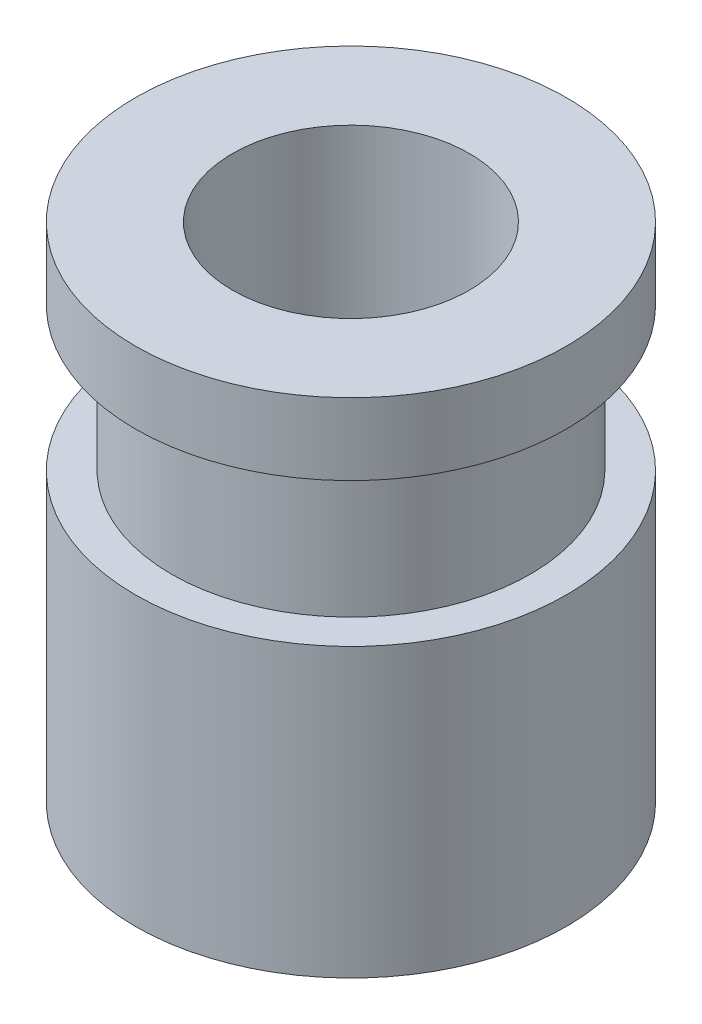
ISO-10303-21;
HEADER;
FILE_DESCRIPTION(('STEP AP214'),'2;1');
FILE_NAME('part.step','',(''),(''),'','','');
FILE_SCHEMA(('AUTOMOTIVE_DESIGN { 1 0 10303 214 1 1 1 1 }'));
ENDSEC;
DATA;
#1=APPLICATION_CONTEXT('core data for automotive mechanical design processes');
#2=APPLICATION_PROTOCOL_DEFINITION('international standard','automotive_design',2000,#1);
#3=PRODUCT_CONTEXT('',#1,'mechanical');
#4=PRODUCT('Part','Part','',(#3));
#5=PRODUCT_RELATED_PRODUCT_CATEGORY('part','',(#4));
#6=PRODUCT_DEFINITION_FORMATION('','',#4);
#7=PRODUCT_DEFINITION_CONTEXT('part definition',#1,'design');
#8=PRODUCT_DEFINITION('design','',#6,#7);
#9=PRODUCT_DEFINITION_SHAPE('','',#8);
#10=(LENGTH_UNIT() NAMED_UNIT(*) SI_UNIT(.MILLI.,.METRE.));
#11=(NAMED_UNIT(*) PLANE_ANGLE_UNIT() SI_UNIT($,.RADIAN.));
#12=(NAMED_UNIT(*) SI_UNIT($,.STERADIAN.) SOLID_ANGLE_UNIT());
#13=UNCERTAINTY_MEASURE_WITH_UNIT(LENGTH_MEASURE(1.E-05),#10,'distance_accuracy_value','');
#14=(GEOMETRIC_REPRESENTATION_CONTEXT(3) GLOBAL_UNCERTAINTY_ASSIGNED_CONTEXT((#13)) GLOBAL_UNIT_ASSIGNED_CONTEXT((#10,
#11,#12)) REPRESENTATION_CONTEXT('',''));
#15=CARTESIAN_POINT('',(0.,0.,0.));
#16=DIRECTION('',(0.,0.,1.));
#17=DIRECTION('',(1.,0.,0.));
#18=AXIS2_PLACEMENT_3D('',#15,#16,#17);
#19=CARTESIAN_POINT('',(0.,4.,0.));
#20=DIRECTION('',(0.,1.,0.));
#21=DIRECTION('',(0.,0.,1.));
#22=AXIS2_PLACEMENT_3D('',#19,#20,#21);
#23=PLANE('',#22);
#24=CARTESIAN_POINT('',(0.,4.,0.));
#25=DIRECTION('',(0.,1.,0.));
#26=DIRECTION('',(0.,0.,1.));
#27=AXIS2_PLACEMENT_3D('',#24,#25,#26);
#28=CIRCLE('',#27,2.5);
#29=CARTESIAN_POINT('',(0.,4.,2.5));
#30=VERTEX_POINT('',#29);
#31=EDGE_CURVE('E10',#30,#30,#28,.T.);
#32=ORIENTED_EDGE('',*,*,#31,.F.);
#33=EDGE_LOOP('',(#32));
#34=FACE_BOUND('',#33,.T.);
#35=CARTESIAN_POINT('',(0.,4.,0.));
#36=DIRECTION('',(0.,1.,0.));
#37=DIRECTION('',(0.,0.,1.));
#38=AXIS2_PLACEMENT_3D('',#35,#36,#37);
#39=CIRCLE('',#38,3.);
#40=CARTESIAN_POINT('',(0.,4.,3.));
#41=VERTEX_POINT('',#40);
#42=EDGE_CURVE('E45',#41,#41,#39,.T.);
#43=ORIENTED_EDGE('',*,*,#42,.T.);
#44=EDGE_LOOP('',(#43));
#45=FACE_BOUND('',#44,.T.);
#46=ADVANCED_FACE('F37',(#34,#45),#23,.T.);
#47=CARTESIAN_POINT('',(0.,0.,0.));
#48=DIRECTION('',(0.,1.,0.));
#49=DIRECTION('',(0.,0.,1.));
#50=AXIS2_PLACEMENT_3D('',#47,#48,#49);
#51=PLANE('',#50);
#52=CARTESIAN_POINT('',(0.,0.,0.));
#53=DIRECTION('',(0.,1.,0.));
#54=DIRECTION('',(0.,0.,1.));
#55=AXIS2_PLACEMENT_3D('',#52,#53,#54);
#56=CIRCLE('',#55,3.);
#57=CARTESIAN_POINT('',(0.,0.,3.));
#58=VERTEX_POINT('',#57);
#59=EDGE_CURVE('E41',#58,#58,#56,.T.);
#60=ORIENTED_EDGE('',*,*,#59,.F.);
#61=EDGE_LOOP('',(#60));
#62=FACE_BOUND('',#61,.T.);
#63=CARTESIAN_POINT('',(0.,0.,0.));
#64=DIRECTION('',(0.,1.,0.));
#65=DIRECTION('',(0.,0.,1.));
#66=AXIS2_PLACEMENT_3D('',#63,#64,#65);
#67=CIRCLE('',#66,1.65);
#68=CARTESIAN_POINT('',(0.,0.,1.65));
#69=VERTEX_POINT('',#68);
#70=EDGE_CURVE('E54',#69,#69,#67,.T.);
#71=ORIENTED_EDGE('',*,*,#70,.T.);
#72=EDGE_LOOP('',(#71));
#73=FACE_BOUND('',#72,.T.);
#74=ADVANCED_FACE('F91',(#62,#73),#51,.F.);
#75=CARTESIAN_POINT('',(0.,4.,0.));
#76=DIRECTION('',(0.,-1.,0.));
#77=DIRECTION('',(0.,0.,-1.));
#78=AXIS2_PLACEMENT_3D('',#75,#76,#77);
#79=CYLINDRICAL_SURFACE('',#78,3.);
#80=ORIENTED_EDGE('',*,*,#42,.F.);
#81=EDGE_LOOP('',(#80));
#82=FACE_BOUND('',#81,.T.);
#83=ORIENTED_EDGE('',*,*,#59,.T.);
#84=EDGE_LOOP('',(#83));
#85=FACE_BOUND('',#84,.T.);
#86=ADVANCED_FACE('F39',(#82,#85),#79,.T.);
#87=CARTESIAN_POINT('',(0.,4.,0.));
#88=DIRECTION('',(0.,-1.,0.));
#89=DIRECTION('',(0.,0.,-1.));
#90=AXIS2_PLACEMENT_3D('',#87,#88,#89);
#91=CYLINDRICAL_SURFACE('',#90,1.65);
#92=ORIENTED_EDGE('',*,*,#70,.F.);
#93=EDGE_LOOP('',(#92));
#94=FACE_BOUND('',#93,.T.);
#95=CARTESIAN_POINT('',(0.,7.,0.));
#96=DIRECTION('',(0.,1.,0.));
#97=DIRECTION('',(0.,0.,1.));
#98=AXIS2_PLACEMENT_3D('',#95,#96,#97);
#99=CIRCLE('',#98,1.65);
#100=CARTESIAN_POINT('',(0.,7.,1.65));
#101=VERTEX_POINT('',#100);
#102=EDGE_CURVE('E69',#101,#101,#99,.T.);
#103=ORIENTED_EDGE('',*,*,#102,.T.);
#104=EDGE_LOOP('',(#103));
#105=FACE_BOUND('',#104,.T.);
#106=ADVANCED_FACE('F74',(#94,#105),#91,.F.);
#107=CARTESIAN_POINT('',(0.,6.,0.));
#108=DIRECTION('',(0.,-1.,0.));
#109=DIRECTION('',(0.,0.,-1.));
#110=AXIS2_PLACEMENT_3D('',#107,#108,#109);
#111=CYLINDRICAL_SURFACE('',#110,2.5);
#112=CARTESIAN_POINT('',(0.,6.,0.));
#113=DIRECTION('',(0.,1.,0.));
#114=DIRECTION('',(0.,0.,1.));
#115=AXIS2_PLACEMENT_3D('',#112,#113,#114);
#116=CIRCLE('',#115,2.5);
#117=CARTESIAN_POINT('',(0.,6.,2.5));
#118=VERTEX_POINT('',#117);
#119=EDGE_CURVE('E52',#118,#118,#116,.T.);
#120=ORIENTED_EDGE('',*,*,#119,.F.);
#121=EDGE_LOOP('',(#120));
#122=FACE_BOUND('',#121,.T.);
#123=ORIENTED_EDGE('',*,*,#31,.T.);
#124=EDGE_LOOP('',(#123));
#125=FACE_BOUND('',#124,.T.);
#126=ADVANCED_FACE('F79',(#122,#125),#111,.T.);
#127=CARTESIAN_POINT('',(0.,7.,0.));
#128=DIRECTION('',(0.,1.,0.));
#129=DIRECTION('',(0.,0.,1.));
#130=AXIS2_PLACEMENT_3D('',#127,#128,#129);
#131=PLANE('',#130);
#132=CARTESIAN_POINT('',(0.,7.,0.));
#133=DIRECTION('',(0.,1.,0.));
#134=DIRECTION('',(0.,0.,1.));
#135=AXIS2_PLACEMENT_3D('',#132,#133,#134);
#136=CIRCLE('',#135,3.);
#137=CARTESIAN_POINT('',(0.,7.,3.));
#138=VERTEX_POINT('',#137);
#139=EDGE_CURVE('E60',#138,#138,#136,.T.);
#140=ORIENTED_EDGE('',*,*,#139,.T.);
#141=EDGE_LOOP('',(#140));
#142=FACE_BOUND('',#141,.T.);
#143=ORIENTED_EDGE('',*,*,#102,.F.);
#144=EDGE_LOOP('',(#143));
#145=FACE_BOUND('',#144,.T.);
#146=ADVANCED_FACE('F76',(#142,#145),#131,.T.);
#147=CARTESIAN_POINT('',(0.,6.,0.));
#148=DIRECTION('',(0.,1.,0.));
#149=DIRECTION('',(0.,0.,1.));
#150=AXIS2_PLACEMENT_3D('',#147,#148,#149);
#151=PLANE('',#150);
#152=ORIENTED_EDGE('',*,*,#119,.T.);
#153=EDGE_LOOP('',(#152));
#154=FACE_BOUND('',#153,.T.);
#155=CARTESIAN_POINT('',(0.,6.,0.));
#156=DIRECTION('',(0.,1.,0.));
#157=DIRECTION('',(0.,0.,1.));
#158=AXIS2_PLACEMENT_3D('',#155,#156,#157);
#159=CIRCLE('',#158,3.);
#160=CARTESIAN_POINT('',(0.,6.,3.));
#161=VERTEX_POINT('',#160);
#162=EDGE_CURVE('E64',#161,#161,#159,.T.);
#163=ORIENTED_EDGE('',*,*,#162,.F.);
#164=EDGE_LOOP('',(#163));
#165=FACE_BOUND('',#164,.T.);
#166=ADVANCED_FACE('F78',(#154,#165),#151,.F.);
#167=CARTESIAN_POINT('',(0.,7.,0.));
#168=DIRECTION('',(0.,-1.,0.));
#169=DIRECTION('',(0.,0.,-1.));
#170=AXIS2_PLACEMENT_3D('',#167,#168,#169);
#171=CYLINDRICAL_SURFACE('',#170,3.);
#172=ORIENTED_EDGE('',*,*,#139,.F.);
#173=EDGE_LOOP('',(#172));
#174=FACE_BOUND('',#173,.T.);
#175=ORIENTED_EDGE('',*,*,#162,.T.);
#176=EDGE_LOOP('',(#175));
#177=FACE_BOUND('',#176,.T.);
#178=ADVANCED_FACE('F85',(#174,#177),#171,.T.);
#179=CLOSED_SHELL('',(#46,#74,#86,#106,#126,#146,#166,#178));
#180=MANIFOLD_SOLID_BREP('B2',#179);
#181=ADVANCED_BREP_SHAPE_REPRESENTATION('',(#18,#180),#14);
#182=SHAPE_DEFINITION_REPRESENTATION(#9,#181);
ENDSEC;
END-ISO-10303-21;
